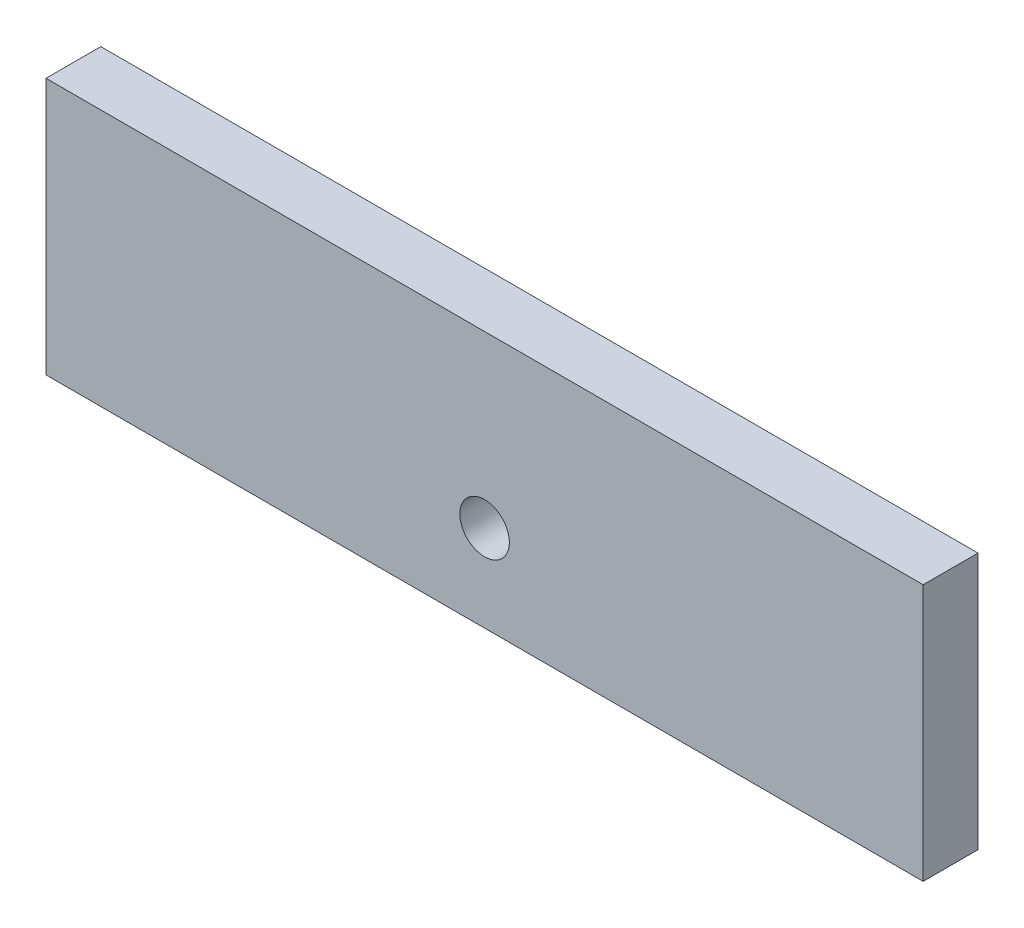
ISO-10303-21;
HEADER;
FILE_DESCRIPTION(('STEP AP214'),'2;1');
FILE_NAME('part.step','',(''),(''),'','','');
FILE_SCHEMA(('AUTOMOTIVE_DESIGN { 1 0 10303 214 1 1 1 1 }'));
ENDSEC;
DATA;
#1=APPLICATION_CONTEXT('core data for automotive mechanical design processes');
#2=APPLICATION_PROTOCOL_DEFINITION('international standard','automotive_design',2000,#1);
#3=PRODUCT_CONTEXT('',#1,'mechanical');
#4=PRODUCT('Part','Part','',(#3));
#5=PRODUCT_RELATED_PRODUCT_CATEGORY('part','',(#4));
#6=PRODUCT_DEFINITION_FORMATION('','',#4);
#7=PRODUCT_DEFINITION_CONTEXT('part definition',#1,'design');
#8=PRODUCT_DEFINITION('design','',#6,#7);
#9=PRODUCT_DEFINITION_SHAPE('','',#8);
#10=(LENGTH_UNIT() NAMED_UNIT(*) SI_UNIT(.MILLI.,.METRE.));
#11=(NAMED_UNIT(*) PLANE_ANGLE_UNIT() SI_UNIT($,.RADIAN.));
#12=(NAMED_UNIT(*) SI_UNIT($,.STERADIAN.) SOLID_ANGLE_UNIT());
#13=UNCERTAINTY_MEASURE_WITH_UNIT(LENGTH_MEASURE(1.E-05),#10,'distance_accuracy_value','');
#14=(GEOMETRIC_REPRESENTATION_CONTEXT(3) GLOBAL_UNCERTAINTY_ASSIGNED_CONTEXT((#13)) GLOBAL_UNIT_ASSIGNED_CONTEXT((#10,
#11,#12)) REPRESENTATION_CONTEXT('',''));
#15=CARTESIAN_POINT('',(0.,0.,0.));
#16=DIRECTION('',(0.,0.,1.));
#17=DIRECTION('',(1.,0.,0.));
#18=AXIS2_PLACEMENT_3D('',#15,#16,#17);
#19=CARTESIAN_POINT('',(0.,0.,-6.35));
#20=DIRECTION('',(-1.,0.,0.));
#21=DIRECTION('',(0.,0.,1.));
#22=AXIS2_PLACEMENT_3D('',#19,#20,#21);
#23=PLANE('',#22);
#24=DIRECTION('',(0.,-1.,0.));
#25=VECTOR('',#24,1.);
#26=CARTESIAN_POINT('',(0.,0.,0.));
#27=LINE('',#26,#25);
#28=CARTESIAN_POINT('',(0.,29.7561,0.));
#29=VERTEX_POINT('',#28);
#30=CARTESIAN_POINT('',(0.,0.,0.));
#31=VERTEX_POINT('',#30);
#32=EDGE_CURVE('E121',#29,#31,#27,.T.);
#33=ORIENTED_EDGE('',*,*,#32,.F.);
#34=DIRECTION('',(0.,0.,1.));
#35=VECTOR('',#34,1.);
#36=CARTESIAN_POINT('',(0.,29.7561,-6.35));
#37=LINE('',#36,#35);
#38=CARTESIAN_POINT('',(0.,29.7561,-6.35));
#39=VERTEX_POINT('',#38);
#40=EDGE_CURVE('E11',#39,#29,#37,.T.);
#41=ORIENTED_EDGE('',*,*,#40,.F.);
#42=DIRECTION('',(0.,-1.,0.));
#43=VECTOR('',#42,1.);
#44=CARTESIAN_POINT('',(0.,0.,-6.35));
#45=LINE('',#44,#43);
#46=CARTESIAN_POINT('',(0.,0.,-6.35));
#47=VERTEX_POINT('',#46);
#48=EDGE_CURVE('E110',#39,#47,#45,.T.);
#49=ORIENTED_EDGE('',*,*,#48,.T.);
#50=DIRECTION('',(0.,0.,1.));
#51=VECTOR('',#50,1.);
#52=CARTESIAN_POINT('',(0.,0.,-6.35));
#53=LINE('',#52,#51);
#54=EDGE_CURVE('E43',#47,#31,#53,.T.);
#55=ORIENTED_EDGE('',*,*,#54,.T.);
#56=EDGE_LOOP('',(#33,#41,#49,#55));
#57=FACE_BOUND('',#56,.T.);
#58=ADVANCED_FACE('F40',(#57),#23,.T.);
#59=CARTESIAN_POINT('',(0.,29.7561,-6.35));
#60=DIRECTION('',(0.,1.,0.));
#61=DIRECTION('',(0.,0.,1.));
#62=AXIS2_PLACEMENT_3D('',#59,#60,#61);
#63=PLANE('',#62);
#64=DIRECTION('',(-1.,0.,0.));
#65=VECTOR('',#64,1.);
#66=CARTESIAN_POINT('',(0.,29.7561,0.));
#67=LINE('',#66,#65);
#68=CARTESIAN_POINT('',(101.6,29.7561,0.));
#69=VERTEX_POINT('',#68);
#70=EDGE_CURVE('E115',#69,#29,#67,.T.);
#71=ORIENTED_EDGE('',*,*,#70,.F.);
#72=DIRECTION('',(0.,0.,1.));
#73=VECTOR('',#72,1.);
#74=CARTESIAN_POINT('',(101.6,29.7561,-6.35));
#75=LINE('',#74,#73);
#76=CARTESIAN_POINT('',(101.6,29.7561,-6.35));
#77=VERTEX_POINT('',#76);
#78=EDGE_CURVE('E50',#77,#69,#75,.T.);
#79=ORIENTED_EDGE('',*,*,#78,.F.);
#80=DIRECTION('',(-1.,0.,0.));
#81=VECTOR('',#80,1.);
#82=CARTESIAN_POINT('',(0.,29.7561,-6.35));
#83=LINE('',#82,#81);
#84=EDGE_CURVE('E105',#77,#39,#83,.T.);
#85=ORIENTED_EDGE('',*,*,#84,.T.);
#86=ORIENTED_EDGE('',*,*,#40,.T.);
#87=EDGE_LOOP('',(#71,#79,#85,#86));
#88=FACE_BOUND('',#87,.T.);
#89=ADVANCED_FACE('F142',(#88),#63,.T.);
#90=CARTESIAN_POINT('',(101.6,0.,-6.35));
#91=DIRECTION('',(1.,0.,0.));
#92=DIRECTION('',(0.,0.,-1.));
#93=AXIS2_PLACEMENT_3D('',#90,#91,#92);
#94=PLANE('',#93);
#95=DIRECTION('',(0.,1.,0.));
#96=VECTOR('',#95,1.);
#97=CARTESIAN_POINT('',(101.6,0.,0.));
#98=LINE('',#97,#96);
#99=CARTESIAN_POINT('',(101.6,0.,0.));
#100=VERTEX_POINT('',#99);
#101=EDGE_CURVE('E99',#100,#69,#98,.T.);
#102=ORIENTED_EDGE('',*,*,#101,.F.);
#103=DIRECTION('',(0.,0.,1.));
#104=VECTOR('',#103,1.);
#105=CARTESIAN_POINT('',(101.6,0.,-6.35));
#106=LINE('',#105,#104);
#107=CARTESIAN_POINT('',(101.6,0.,-6.35));
#108=VERTEX_POINT('',#107);
#109=EDGE_CURVE('E94',#108,#100,#106,.T.);
#110=ORIENTED_EDGE('',*,*,#109,.F.);
#111=DIRECTION('',(0.,1.,0.));
#112=VECTOR('',#111,1.);
#113=CARTESIAN_POINT('',(101.6,0.,-6.35));
#114=LINE('',#113,#112);
#115=EDGE_CURVE('E97',#108,#77,#114,.T.);
#116=ORIENTED_EDGE('',*,*,#115,.T.);
#117=ORIENTED_EDGE('',*,*,#78,.T.);
#118=EDGE_LOOP('',(#102,#110,#116,#117));
#119=FACE_BOUND('',#118,.T.);
#120=ADVANCED_FACE('F96',(#119),#94,.T.);
#121=CARTESIAN_POINT('',(0.,0.,-6.35));
#122=DIRECTION('',(0.,-1.,0.));
#123=DIRECTION('',(0.,0.,-1.));
#124=AXIS2_PLACEMENT_3D('',#121,#122,#123);
#125=PLANE('',#124);
#126=DIRECTION('',(1.,0.,0.));
#127=VECTOR('',#126,1.);
#128=CARTESIAN_POINT('',(0.,0.,0.));
#129=LINE('',#128,#127);
#130=EDGE_CURVE('E125',#31,#100,#129,.T.);
#131=ORIENTED_EDGE('',*,*,#130,.F.);
#132=ORIENTED_EDGE('',*,*,#54,.F.);
#133=DIRECTION('',(1.,0.,0.));
#134=VECTOR('',#133,1.);
#135=CARTESIAN_POINT('',(0.,0.,-6.35));
#136=LINE('',#135,#134);
#137=EDGE_CURVE('E104',#47,#108,#136,.T.);
#138=ORIENTED_EDGE('',*,*,#137,.T.);
#139=ORIENTED_EDGE('',*,*,#109,.T.);
#140=EDGE_LOOP('',(#131,#132,#138,#139));
#141=FACE_BOUND('',#140,.T.);
#142=ADVANCED_FACE('F108',(#141),#125,.T.);
#143=CARTESIAN_POINT('',(0.,0.,-6.35));
#144=DIRECTION('',(0.,0.,-1.));
#145=DIRECTION('',(-1.,0.,0.));
#146=AXIS2_PLACEMENT_3D('',#143,#144,#145);
#147=PLANE('',#146);
#148=CARTESIAN_POINT('',(50.8,10.02665,-6.35));
#149=DIRECTION('',(0.,0.,1.));
#150=DIRECTION('',(1.,0.,0.));
#151=AXIS2_PLACEMENT_3D('',#148,#149,#150);
#152=CIRCLE('',#151,2.8702);
#153=CARTESIAN_POINT('',(53.6702,10.02665,-6.35));
#154=VERTEX_POINT('',#153);
#155=EDGE_CURVE('E126',#154,#154,#152,.T.);
#156=ORIENTED_EDGE('',*,*,#155,.T.);
#157=EDGE_LOOP('',(#156));
#158=FACE_BOUND('',#157,.T.);
#159=ORIENTED_EDGE('',*,*,#48,.F.);
#160=ORIENTED_EDGE('',*,*,#84,.F.);
#161=ORIENTED_EDGE('',*,*,#115,.F.);
#162=ORIENTED_EDGE('',*,*,#137,.F.);
#163=EDGE_LOOP('',(#159,#160,#161,#162));
#164=FACE_BOUND('',#163,.T.);
#165=ADVANCED_FACE('F103',(#158,#164),#147,.T.);
#166=CARTESIAN_POINT('',(0.,0.,0.));
#167=DIRECTION('',(0.,0.,-1.));
#168=DIRECTION('',(-1.,0.,0.));
#169=AXIS2_PLACEMENT_3D('',#166,#167,#168);
#170=PLANE('',#169);
#171=CARTESIAN_POINT('',(50.8,10.02665,0.));
#172=DIRECTION('',(0.,0.,1.));
#173=DIRECTION('',(1.,0.,0.));
#174=AXIS2_PLACEMENT_3D('',#171,#172,#173);
#175=CIRCLE('',#174,2.8702);
#176=CARTESIAN_POINT('',(53.6702,10.02665,0.));
#177=VERTEX_POINT('',#176);
#178=EDGE_CURVE('E137',#177,#177,#175,.T.);
#179=ORIENTED_EDGE('',*,*,#178,.F.);
#180=EDGE_LOOP('',(#179));
#181=FACE_BOUND('',#180,.T.);
#182=ORIENTED_EDGE('',*,*,#32,.T.);
#183=ORIENTED_EDGE('',*,*,#130,.T.);
#184=ORIENTED_EDGE('',*,*,#101,.T.);
#185=ORIENTED_EDGE('',*,*,#70,.T.);
#186=EDGE_LOOP('',(#182,#183,#184,#185));
#187=FACE_BOUND('',#186,.T.);
#188=ADVANCED_FACE('F141',(#181,#187),#170,.F.);
#189=CARTESIAN_POINT('',(50.8,10.02665,-6.35));
#190=DIRECTION('',(0.,0.,1.));
#191=DIRECTION('',(1.,0.,0.));
#192=AXIS2_PLACEMENT_3D('',#189,#190,#191);
#193=CYLINDRICAL_SURFACE('',#192,2.8702);
#194=ORIENTED_EDGE('',*,*,#155,.F.);
#195=EDGE_LOOP('',(#194));
#196=FACE_BOUND('',#195,.T.);
#197=ORIENTED_EDGE('',*,*,#178,.T.);
#198=EDGE_LOOP('',(#197));
#199=FACE_BOUND('',#198,.T.);
#200=ADVANCED_FACE('F160',(#196,#199),#193,.F.);
#201=CLOSED_SHELL('',(#58,#89,#120,#142,#165,#188,#200));
#202=MANIFOLD_SOLID_BREP('B2',#201);
#203=ADVANCED_BREP_SHAPE_REPRESENTATION('',(#18,#202),#14);
#204=SHAPE_DEFINITION_REPRESENTATION(#9,#203);
ENDSEC;
END-ISO-10303-21;
